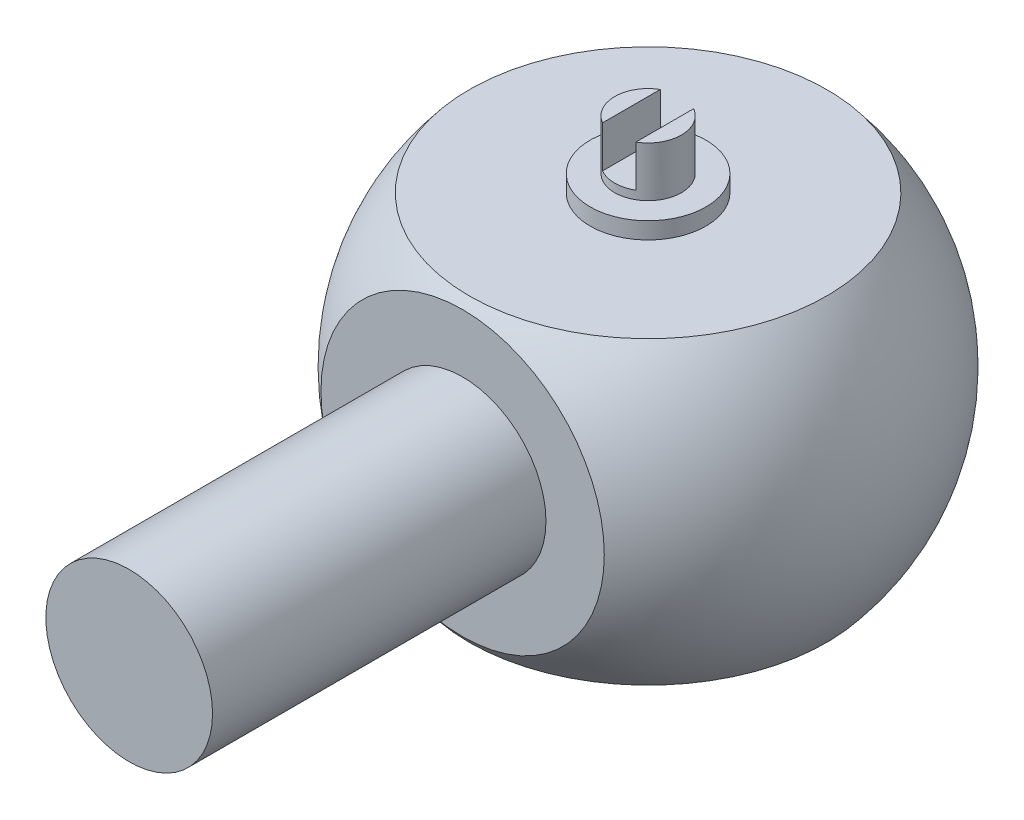
ISO-10303-21;
HEADER;
FILE_DESCRIPTION(('STEP AP214'),'2;1');
FILE_NAME('part.step','',(''),(''),'','','');
FILE_SCHEMA(('AUTOMOTIVE_DESIGN { 1 0 10303 214 1 1 1 1 }'));
ENDSEC;
DATA;
#1=APPLICATION_CONTEXT('core data for automotive mechanical design processes');
#2=APPLICATION_PROTOCOL_DEFINITION('international standard','automotive_design',2000,#1);
#3=PRODUCT_CONTEXT('',#1,'mechanical');
#4=PRODUCT('Part','Part','',(#3));
#5=PRODUCT_RELATED_PRODUCT_CATEGORY('part','',(#4));
#6=PRODUCT_DEFINITION_FORMATION('','',#4);
#7=PRODUCT_DEFINITION_CONTEXT('part definition',#1,'design');
#8=PRODUCT_DEFINITION('design','',#6,#7);
#9=PRODUCT_DEFINITION_SHAPE('','',#8);
#10=(LENGTH_UNIT() NAMED_UNIT(*) SI_UNIT(.MILLI.,.METRE.));
#11=(NAMED_UNIT(*) PLANE_ANGLE_UNIT() SI_UNIT($,.RADIAN.));
#12=(NAMED_UNIT(*) SI_UNIT($,.STERADIAN.) SOLID_ANGLE_UNIT());
#13=UNCERTAINTY_MEASURE_WITH_UNIT(LENGTH_MEASURE(1.E-05),#10,'distance_accuracy_value','');
#14=(GEOMETRIC_REPRESENTATION_CONTEXT(3) GLOBAL_UNCERTAINTY_ASSIGNED_CONTEXT((#13)) GLOBAL_UNIT_ASSIGNED_CONTEXT((#10,
#11,#12)) REPRESENTATION_CONTEXT('',''));
#15=CARTESIAN_POINT('',(0.,0.,0.));
#16=DIRECTION('',(0.,0.,1.));
#17=DIRECTION('',(1.,0.,0.));
#18=AXIS2_PLACEMENT_3D('',#15,#16,#17);
#19=CARTESIAN_POINT('',(0.,9.,0.));
#20=DIRECTION('',(0.,1.,0.));
#21=DIRECTION('',(0.,0.,1.));
#22=AXIS2_PLACEMENT_3D('',#19,#20,#21);
#23=CYLINDRICAL_SURFACE('',#22,2.);
#24=CARTESIAN_POINT('',(0.,10.,0.));
#25=DIRECTION('',(0.,1.,0.));
#26=DIRECTION('',(0.,0.,1.));
#27=AXIS2_PLACEMENT_3D('',#24,#25,#26);
#28=CIRCLE('',#27,2.);
#29=CARTESIAN_POINT('',(0.,10.,2.));
#30=VERTEX_POINT('',#29);
#31=EDGE_CURVE('E122',#30,#30,#28,.T.);
#32=ORIENTED_EDGE('',*,*,#31,.T.);
#33=EDGE_LOOP('',(#32));
#34=FACE_BOUND('',#33,.T.);
#35=DIRECTION('',(0.,1.,0.));
#36=VECTOR('',#35,1.);
#37=CARTESIAN_POINT('',(1.,9.,1.73205080756888));
#38=LINE('',#37,#36);
#39=CARTESIAN_POINT('',(1.,10.5,1.73205080756888));
#40=VERTEX_POINT('',#39);
#41=CARTESIAN_POINT('',(1.,13.,1.73205080756888));
#42=VERTEX_POINT('',#41);
#43=EDGE_CURVE('E47',#40,#42,#38,.T.);
#44=ORIENTED_EDGE('',*,*,#43,.F.);
#45=CARTESIAN_POINT('',(0.,10.5,0.));
#46=DIRECTION('',(0.,1.,0.));
#47=DIRECTION('',(0.,0.,1.));
#48=AXIS2_PLACEMENT_3D('',#45,#46,#47);
#49=CIRCLE('',#48,2.);
#50=CARTESIAN_POINT('',(-0.999999999999999,10.5,1.73205080756888));
#51=VERTEX_POINT('',#50);
#52=EDGE_CURVE('E11',#51,#40,#49,.T.);
#53=ORIENTED_EDGE('',*,*,#52,.F.);
#54=DIRECTION('',(0.,1.,0.));
#55=VECTOR('',#54,1.);
#56=CARTESIAN_POINT('',(-0.999999999999999,9.,1.73205080756888));
#57=LINE('',#56,#55);
#58=CARTESIAN_POINT('',(-0.999999999999999,13.,1.73205080756888));
#59=VERTEX_POINT('',#58);
#60=EDGE_CURVE('E84',#59,#51,#57,.F.);
#61=ORIENTED_EDGE('',*,*,#60,.F.);
#62=CARTESIAN_POINT('',(0.,13.,0.));
#63=DIRECTION('',(0.,1.,0.));
#64=DIRECTION('',(0.,0.,1.));
#65=AXIS2_PLACEMENT_3D('',#62,#63,#64);
#66=CIRCLE('',#65,2.);
#67=CARTESIAN_POINT('',(-0.999999999999999,13.,-1.73205080756888));
#68=VERTEX_POINT('',#67);
#69=EDGE_CURVE('E119',#68,#59,#66,.T.);
#70=ORIENTED_EDGE('',*,*,#69,.F.);
#71=DIRECTION('',(0.,1.,0.));
#72=VECTOR('',#71,1.);
#73=CARTESIAN_POINT('',(-0.999999999999999,9.,-1.73205080756888));
#74=LINE('',#73,#72);
#75=CARTESIAN_POINT('',(-0.999999999999999,10.5,-1.73205080756888));
#76=VERTEX_POINT('',#75);
#77=EDGE_CURVE('E86',#76,#68,#74,.T.);
#78=ORIENTED_EDGE('',*,*,#77,.F.);
#79=CARTESIAN_POINT('',(1.,10.5,-1.73205080756888));
#80=VERTEX_POINT('',#79);
#81=EDGE_CURVE('E36',#80,#76,#49,.T.);
#82=ORIENTED_EDGE('',*,*,#81,.F.);
#83=DIRECTION('',(0.,1.,0.));
#84=VECTOR('',#83,1.);
#85=CARTESIAN_POINT('',(1.,9.,-1.73205080756888));
#86=LINE('',#85,#84);
#87=CARTESIAN_POINT('',(1.,13.,-1.73205080756888));
#88=VERTEX_POINT('',#87);
#89=EDGE_CURVE('E79',#88,#80,#86,.F.);
#90=ORIENTED_EDGE('',*,*,#89,.F.);
#91=EDGE_CURVE('E83',#42,#88,#66,.T.);
#92=ORIENTED_EDGE('',*,*,#91,.F.);
#93=EDGE_LOOP('',(#44,#53,#61,#70,#78,#82,#90,#92));
#94=FACE_BOUND('',#93,.T.);
#95=ADVANCED_FACE('F32',(#34,#94),#23,.T.);
#96=CARTESIAN_POINT('',(0.,13.,0.));
#97=DIRECTION('',(0.,-1.,0.));
#98=DIRECTION('',(0.,0.,-1.));
#99=AXIS2_PLACEMENT_3D('',#96,#97,#98);
#100=PLANE('',#99);
#101=DIRECTION('',(0.,0.,1.));
#102=VECTOR('',#101,1.);
#103=CARTESIAN_POINT('',(-0.999999999999999,13.,0.));
#104=LINE('',#103,#102);
#105=EDGE_CURVE('E132',#68,#59,#104,.T.);
#106=ORIENTED_EDGE('',*,*,#105,.F.);
#107=ORIENTED_EDGE('',*,*,#69,.T.);
#108=EDGE_LOOP('',(#106,#107));
#109=FACE_BOUND('',#108,.T.);
#110=ADVANCED_FACE('F139',(#109),#100,.F.);
#111=DIRECTION('',(0.,0.,-1.));
#112=VECTOR('',#111,1.);
#113=CARTESIAN_POINT('',(1.,13.,0.));
#114=LINE('',#113,#112);
#115=EDGE_CURVE('E131',#42,#88,#114,.T.);
#116=ORIENTED_EDGE('',*,*,#115,.F.);
#117=ORIENTED_EDGE('',*,*,#91,.T.);
#118=EDGE_LOOP('',(#116,#117));
#119=FACE_BOUND('',#118,.T.);
#120=ADVANCED_FACE('F141',(#119),#100,.F.);
#121=CARTESIAN_POINT('',(15.,-8.4979279296415,11.1258806798662));
#122=DIRECTION('',(0.,0.,1.));
#123=DIRECTION('',(0.,-1.,0.));
#124=AXIS2_PLACEMENT_3D('',#121,#122,#123);
#125=PLANE('',#124);
#126=CARTESIAN_POINT('',(0.,0.,11.1258806798662));
#127=DIRECTION('',(0.,0.,1.));
#128=DIRECTION('',(0.,-1.,0.));
#129=AXIS2_PLACEMENT_3D('',#126,#127,#128);
#130=CIRCLE('',#129,8.4979279296415);
#131=CARTESIAN_POINT('',(0.,-8.4979279296415,11.1258806798662));
#132=VERTEX_POINT('',#131);
#133=EDGE_CURVE('E128',#132,#132,#130,.T.);
#134=ORIENTED_EDGE('',*,*,#133,.T.);
#135=EDGE_LOOP('',(#134));
#136=FACE_BOUND('',#135,.T.);
#137=CARTESIAN_POINT('',(0.,0.,11.1258806798662));
#138=DIRECTION('',(0.,0.,1.));
#139=DIRECTION('',(1.,0.,0.));
#140=AXIS2_PLACEMENT_3D('',#137,#138,#139);
#141=CIRCLE('',#140,5.);
#142=CARTESIAN_POINT('',(5.,0.,11.1258806798662));
#143=VERTEX_POINT('',#142);
#144=EDGE_CURVE('E92',#143,#143,#141,.T.);
#145=ORIENTED_EDGE('',*,*,#144,.F.);
#146=EDGE_LOOP('',(#145));
#147=FACE_BOUND('',#146,.T.);
#148=ADVANCED_FACE('F147',(#136,#147),#125,.T.);
#149=CARTESIAN_POINT('',(0.,0.,0.));
#150=DIRECTION('',(0.,1.,0.));
#151=DIRECTION('',(1.,0.,0.));
#152=AXIS2_PLACEMENT_3D('',#149,#150,#151);
#153=SPHERICAL_SURFACE('',#152,14.);
#154=CARTESIAN_POINT('',(0.,-9.,0.));
#155=DIRECTION('',(0.,1.,0.));
#156=DIRECTION('',(0.,0.,1.));
#157=AXIS2_PLACEMENT_3D('',#154,#155,#156);
#158=CIRCLE('',#157,10.7238052947636);
#159=CARTESIAN_POINT('',(0.,-9.,10.7238052947636));
#160=VERTEX_POINT('',#159);
#161=EDGE_CURVE('E104',#160,#160,#158,.T.);
#162=ORIENTED_EDGE('',*,*,#161,.T.);
#163=EDGE_LOOP('',(#162));
#164=FACE_BOUND('',#163,.T.);
#165=CARTESIAN_POINT('',(0.,9.,0.));
#166=DIRECTION('',(0.,1.,0.));
#167=DIRECTION('',(0.,0.,1.));
#168=AXIS2_PLACEMENT_3D('',#165,#166,#167);
#169=CIRCLE('',#168,10.7238052947636);
#170=CARTESIAN_POINT('',(0.,9.,10.7238052947636));
#171=VERTEX_POINT('',#170);
#172=EDGE_CURVE('E101',#171,#171,#169,.T.);
#173=ORIENTED_EDGE('',*,*,#172,.F.);
#174=EDGE_LOOP('',(#173));
#175=FACE_BOUND('',#174,.T.);
#176=ORIENTED_EDGE('',*,*,#133,.F.);
#177=EDGE_LOOP('',(#176));
#178=FACE_BOUND('',#177,.T.);
#179=ADVANCED_FACE('F163',(#164,#175,#178),#153,.T.);
#180=CARTESIAN_POINT('',(0.,9.,0.));
#181=DIRECTION('',(0.,1.,0.));
#182=DIRECTION('',(0.,0.,1.));
#183=AXIS2_PLACEMENT_3D('',#180,#181,#182);
#184=CYLINDRICAL_SURFACE('',#183,3.47289893048352);
#185=CARTESIAN_POINT('',(0.,10.,0.));
#186=DIRECTION('',(0.,1.,0.));
#187=DIRECTION('',(0.,0.,1.));
#188=AXIS2_PLACEMENT_3D('',#185,#186,#187);
#189=CIRCLE('',#188,3.47289893048352);
#190=CARTESIAN_POINT('',(0.,10.,3.47289893048352));
#191=VERTEX_POINT('',#190);
#192=EDGE_CURVE('E125',#191,#191,#189,.T.);
#193=ORIENTED_EDGE('',*,*,#192,.F.);
#194=EDGE_LOOP('',(#193));
#195=FACE_BOUND('',#194,.T.);
#196=CARTESIAN_POINT('',(0.,9.,0.));
#197=DIRECTION('',(0.,1.,0.));
#198=DIRECTION('',(0.,0.,1.));
#199=AXIS2_PLACEMENT_3D('',#196,#197,#198);
#200=CIRCLE('',#199,3.47289893048352);
#201=CARTESIAN_POINT('',(0.,9.,3.47289893048352));
#202=VERTEX_POINT('',#201);
#203=EDGE_CURVE('E96',#202,#202,#200,.T.);
#204=ORIENTED_EDGE('',*,*,#203,.T.);
#205=EDGE_LOOP('',(#204));
#206=FACE_BOUND('',#205,.T.);
#207=ADVANCED_FACE('F34',(#195,#206),#184,.T.);
#208=CARTESIAN_POINT('',(2.,10.,0.));
#209=DIRECTION('',(0.,-1.,0.));
#210=DIRECTION('',(0.,0.,-1.));
#211=AXIS2_PLACEMENT_3D('',#208,#209,#210);
#212=PLANE('',#211);
#213=ORIENTED_EDGE('',*,*,#31,.F.);
#214=EDGE_LOOP('',(#213));
#215=FACE_BOUND('',#214,.T.);
#216=ORIENTED_EDGE('',*,*,#192,.T.);
#217=EDGE_LOOP('',(#216));
#218=FACE_BOUND('',#217,.T.);
#219=ADVANCED_FACE('F154',(#215,#218),#212,.F.);
#220=CARTESIAN_POINT('',(0.,-15.,0.));
#221=DIRECTION('',(0.,1.,0.));
#222=DIRECTION('',(0.,0.,1.));
#223=AXIS2_PLACEMENT_3D('',#220,#221,#222);
#224=PLANE('',#223);
#225=CARTESIAN_POINT('',(0.,-15.,0.));
#226=DIRECTION('',(0.,1.,0.));
#227=DIRECTION('',(0.,0.,1.));
#228=AXIS2_PLACEMENT_3D('',#225,#226,#227);
#229=CIRCLE('',#228,2.);
#230=CARTESIAN_POINT('',(0.,-15.,2.));
#231=VERTEX_POINT('',#230);
#232=EDGE_CURVE('E116',#231,#231,#229,.T.);
#233=ORIENTED_EDGE('',*,*,#232,.F.);
#234=EDGE_LOOP('',(#233));
#235=FACE_BOUND('',#234,.T.);
#236=ADVANCED_FACE('F152',(#235),#224,.F.);
#237=CARTESIAN_POINT('',(0.,9.,0.));
#238=DIRECTION('',(0.,1.,0.));
#239=DIRECTION('',(0.,0.,1.));
#240=AXIS2_PLACEMENT_3D('',#237,#238,#239);
#241=CYLINDRICAL_SURFACE('',#240,2.);
#242=CARTESIAN_POINT('',(0.,-10.,0.));
#243=DIRECTION('',(0.,1.,0.));
#244=DIRECTION('',(0.,0.,1.));
#245=AXIS2_PLACEMENT_3D('',#242,#243,#244);
#246=CIRCLE('',#245,2.);
#247=CARTESIAN_POINT('',(0.,-10.,2.));
#248=VERTEX_POINT('',#247);
#249=EDGE_CURVE('E113',#248,#248,#246,.T.);
#250=ORIENTED_EDGE('',*,*,#249,.F.);
#251=EDGE_LOOP('',(#250));
#252=FACE_BOUND('',#251,.T.);
#253=ORIENTED_EDGE('',*,*,#232,.T.);
#254=EDGE_LOOP('',(#253));
#255=FACE_BOUND('',#254,.T.);
#256=ADVANCED_FACE('F161',(#252,#255),#241,.T.);
#257=CARTESIAN_POINT('',(2.,-10.,0.));
#258=DIRECTION('',(0.,1.,0.));
#259=DIRECTION('',(0.,0.,1.));
#260=AXIS2_PLACEMENT_3D('',#257,#258,#259);
#261=PLANE('',#260);
#262=CARTESIAN_POINT('',(0.,-10.,0.));
#263=DIRECTION('',(0.,1.,0.));
#264=DIRECTION('',(0.,0.,1.));
#265=AXIS2_PLACEMENT_3D('',#262,#263,#264);
#266=CIRCLE('',#265,3.45521401603062);
#267=CARTESIAN_POINT('',(0.,-10.,3.45521401603062));
#268=VERTEX_POINT('',#267);
#269=EDGE_CURVE('E110',#268,#268,#266,.T.);
#270=ORIENTED_EDGE('',*,*,#269,.F.);
#271=EDGE_LOOP('',(#270));
#272=FACE_BOUND('',#271,.T.);
#273=ORIENTED_EDGE('',*,*,#249,.T.);
#274=EDGE_LOOP('',(#273));
#275=FACE_BOUND('',#274,.T.);
#276=ADVANCED_FACE('F208',(#272,#275),#261,.F.);
#277=CARTESIAN_POINT('',(0.,9.,0.));
#278=DIRECTION('',(0.,1.,0.));
#279=DIRECTION('',(0.,0.,1.));
#280=AXIS2_PLACEMENT_3D('',#277,#278,#279);
#281=CYLINDRICAL_SURFACE('',#280,3.45521401603062);
#282=CARTESIAN_POINT('',(0.,-9.,0.));
#283=DIRECTION('',(0.,1.,0.));
#284=DIRECTION('',(0.,0.,1.));
#285=AXIS2_PLACEMENT_3D('',#282,#283,#284);
#286=CIRCLE('',#285,3.45521401603062);
#287=CARTESIAN_POINT('',(0.,-9.,3.45521401603062));
#288=VERTEX_POINT('',#287);
#289=EDGE_CURVE('E107',#288,#288,#286,.T.);
#290=ORIENTED_EDGE('',*,*,#289,.F.);
#291=EDGE_LOOP('',(#290));
#292=FACE_BOUND('',#291,.T.);
#293=ORIENTED_EDGE('',*,*,#269,.T.);
#294=EDGE_LOOP('',(#293));
#295=FACE_BOUND('',#294,.T.);
#296=ADVANCED_FACE('F204',(#292,#295),#281,.T.);
#297=CARTESIAN_POINT('',(3.45521401603062,-9.,0.));
#298=DIRECTION('',(0.,1.,0.));
#299=DIRECTION('',(0.,0.,1.));
#300=AXIS2_PLACEMENT_3D('',#297,#298,#299);
#301=PLANE('',#300);
#302=ORIENTED_EDGE('',*,*,#161,.F.);
#303=EDGE_LOOP('',(#302));
#304=FACE_BOUND('',#303,.T.);
#305=ORIENTED_EDGE('',*,*,#289,.T.);
#306=EDGE_LOOP('',(#305));
#307=FACE_BOUND('',#306,.T.);
#308=ADVANCED_FACE('F175',(#304,#307),#301,.F.);
#309=CARTESIAN_POINT('',(3.47289893048352,9.,0.));
#310=DIRECTION('',(0.,-1.,0.));
#311=DIRECTION('',(0.,0.,-1.));
#312=AXIS2_PLACEMENT_3D('',#309,#310,#311);
#313=PLANE('',#312);
#314=ORIENTED_EDGE('',*,*,#203,.F.);
#315=EDGE_LOOP('',(#314));
#316=FACE_BOUND('',#315,.T.);
#317=ORIENTED_EDGE('',*,*,#172,.T.);
#318=EDGE_LOOP('',(#317));
#319=FACE_BOUND('',#318,.T.);
#320=ADVANCED_FACE('F171',(#316,#319),#313,.F.);
#321=CARTESIAN_POINT('',(0.,0.,31.1258806798662));
#322=DIRECTION('',(0.,0.,-1.));
#323=DIRECTION('',(-1.,0.,0.));
#324=AXIS2_PLACEMENT_3D('',#321,#322,#323);
#325=CYLINDRICAL_SURFACE('',#324,5.);
#326=CARTESIAN_POINT('',(0.,0.,31.1258806798662));
#327=DIRECTION('',(0.,0.,1.));
#328=DIRECTION('',(1.,0.,0.));
#329=AXIS2_PLACEMENT_3D('',#326,#327,#328);
#330=CIRCLE('',#329,5.);
#331=CARTESIAN_POINT('',(5.,0.,31.1258806798662));
#332=VERTEX_POINT('',#331);
#333=EDGE_CURVE('E93',#332,#332,#330,.T.);
#334=ORIENTED_EDGE('',*,*,#333,.F.);
#335=EDGE_LOOP('',(#334));
#336=FACE_BOUND('',#335,.T.);
#337=ORIENTED_EDGE('',*,*,#144,.T.);
#338=EDGE_LOOP('',(#337));
#339=FACE_BOUND('',#338,.T.);
#340=ADVANCED_FACE('F174',(#336,#339),#325,.T.);
#341=CARTESIAN_POINT('',(0.,0.,31.1258806798662));
#342=DIRECTION('',(0.,0.,1.));
#343=DIRECTION('',(1.,0.,0.));
#344=AXIS2_PLACEMENT_3D('',#341,#342,#343);
#345=PLANE('',#344);
#346=ORIENTED_EDGE('',*,*,#333,.T.);
#347=EDGE_LOOP('',(#346));
#348=FACE_BOUND('',#347,.T.);
#349=ADVANCED_FACE('F191',(#348),#345,.T.);
#350=CARTESIAN_POINT('',(-0.999999999999999,10.5,2.));
#351=DIRECTION('',(0.,1.,0.));
#352=DIRECTION('',(0.,0.,1.));
#353=AXIS2_PLACEMENT_3D('',#350,#351,#352);
#354=PLANE('',#353);
#355=DIRECTION('',(0.,0.,-1.));
#356=VECTOR('',#355,1.);
#357=CARTESIAN_POINT('',(1.,10.5,2.));
#358=LINE('',#357,#356);
#359=EDGE_CURVE('E72',#40,#80,#358,.T.);
#360=ORIENTED_EDGE('',*,*,#359,.T.);
#361=ORIENTED_EDGE('',*,*,#81,.T.);
#362=DIRECTION('',(0.,0.,-1.));
#363=VECTOR('',#362,1.);
#364=CARTESIAN_POINT('',(-0.999999999999999,10.5,2.));
#365=LINE('',#364,#363);
#366=EDGE_CURVE('E73',#51,#76,#365,.T.);
#367=ORIENTED_EDGE('',*,*,#366,.F.);
#368=ORIENTED_EDGE('',*,*,#52,.T.);
#369=EDGE_LOOP('',(#360,#361,#367,#368));
#370=FACE_BOUND('',#369,.T.);
#371=ADVANCED_FACE('F71',(#370),#354,.T.);
#372=CARTESIAN_POINT('',(-0.999999999999999,13.,2.));
#373=DIRECTION('',(1.,0.,0.));
#374=DIRECTION('',(0.,1.,0.));
#375=AXIS2_PLACEMENT_3D('',#372,#373,#374);
#376=PLANE('',#375);
#377=ORIENTED_EDGE('',*,*,#77,.T.);
#378=ORIENTED_EDGE('',*,*,#105,.T.);
#379=ORIENTED_EDGE('',*,*,#60,.T.);
#380=ORIENTED_EDGE('',*,*,#366,.T.);
#381=EDGE_LOOP('',(#377,#378,#379,#380));
#382=FACE_BOUND('',#381,.T.);
#383=ADVANCED_FACE('F135',(#382),#376,.T.);
#384=CARTESIAN_POINT('',(1.,13.,2.));
#385=DIRECTION('',(-1.,0.,0.));
#386=DIRECTION('',(0.,-1.,0.));
#387=AXIS2_PLACEMENT_3D('',#384,#385,#386);
#388=PLANE('',#387);
#389=ORIENTED_EDGE('',*,*,#43,.T.);
#390=ORIENTED_EDGE('',*,*,#115,.T.);
#391=ORIENTED_EDGE('',*,*,#89,.T.);
#392=ORIENTED_EDGE('',*,*,#359,.F.);
#393=EDGE_LOOP('',(#389,#390,#391,#392));
#394=FACE_BOUND('',#393,.T.);
#395=ADVANCED_FACE('F77',(#394),#388,.T.);
#396=CLOSED_SHELL('',(#95,#110,#120,#148,#179,#207,#219,#236,#256,#276,#296,#308,#320,#340,#349,
#371,#383,#395));
#397=MANIFOLD_SOLID_BREP('B2',#396);
#398=ADVANCED_BREP_SHAPE_REPRESENTATION('',(#18,#397),#14);
#399=SHAPE_DEFINITION_REPRESENTATION(#9,#398);
ENDSEC;
END-ISO-10303-21;
